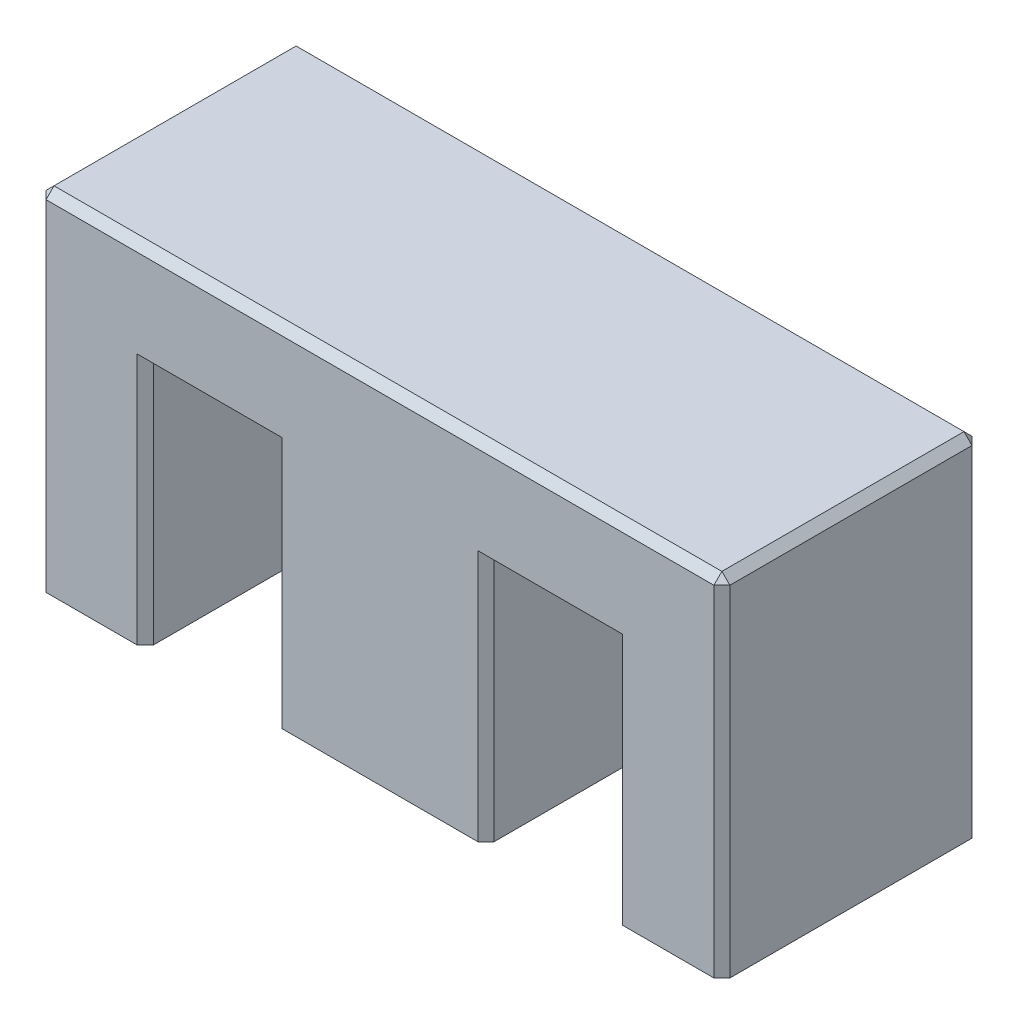
ISO-10303-21;
HEADER;
FILE_DESCRIPTION(('STEP AP214'),'2;1');
FILE_NAME('part.step','',(''),(''),'','','');
FILE_SCHEMA(('AUTOMOTIVE_DESIGN { 1 0 10303 214 1 1 1 1 }'));
ENDSEC;
DATA;
#1=APPLICATION_CONTEXT('core data for automotive mechanical design processes');
#2=APPLICATION_PROTOCOL_DEFINITION('international standard','automotive_design',2000,#1);
#3=PRODUCT_CONTEXT('',#1,'mechanical');
#4=PRODUCT('Part','Part','',(#3));
#5=PRODUCT_RELATED_PRODUCT_CATEGORY('part','',(#4));
#6=PRODUCT_DEFINITION_FORMATION('','',#4);
#7=PRODUCT_DEFINITION_CONTEXT('part definition',#1,'design');
#8=PRODUCT_DEFINITION('design','',#6,#7);
#9=PRODUCT_DEFINITION_SHAPE('','',#8);
#10=(LENGTH_UNIT() NAMED_UNIT(*) SI_UNIT(.MILLI.,.METRE.));
#11=(NAMED_UNIT(*) PLANE_ANGLE_UNIT() SI_UNIT($,.RADIAN.));
#12=(NAMED_UNIT(*) SI_UNIT($,.STERADIAN.) SOLID_ANGLE_UNIT());
#13=UNCERTAINTY_MEASURE_WITH_UNIT(LENGTH_MEASURE(1.E-05),#10,'distance_accuracy_value','');
#14=(GEOMETRIC_REPRESENTATION_CONTEXT(3) GLOBAL_UNCERTAINTY_ASSIGNED_CONTEXT((#13)) GLOBAL_UNIT_ASSIGNED_CONTEXT((#10,
#11,#12)) REPRESENTATION_CONTEXT('',''));
#15=CARTESIAN_POINT('',(0.,0.,0.));
#16=DIRECTION('',(0.,0.,1.));
#17=DIRECTION('',(1.,0.,0.));
#18=AXIS2_PLACEMENT_3D('',#15,#16,#17);
#19=CARTESIAN_POINT('',(13.25,8.75,16.125));
#20=DIRECTION('',(0.,1.,0.));
#21=DIRECTION('',(-1.,0.,0.));
#22=AXIS2_PLACEMENT_3D('',#19,#20,#21);
#23=PLANE('',#22);
#24=DIRECTION('',(0.,0.,-1.));
#25=VECTOR('',#24,1.);
#26=CARTESIAN_POINT('',(13.25,8.75,16.125));
#27=LINE('',#26,#25);
#28=CARTESIAN_POINT('',(13.25,8.75,15.125));
#29=VERTEX_POINT('',#28);
#30=CARTESIAN_POINT('',(13.25,8.75,-15.125));
#31=VERTEX_POINT('',#30);
#32=EDGE_CURVE('E414',#29,#31,#27,.T.);
#33=ORIENTED_EDGE('',*,*,#32,.T.);
#34=DIRECTION('',(1.,0.,0.));
#35=VECTOR('',#34,1.);
#36=CARTESIAN_POINT('',(29.325,8.75,-15.125));
#37=LINE('',#36,#35);
#38=CARTESIAN_POINT('',(29.325,8.75,-15.125));
#39=VERTEX_POINT('',#38);
#40=EDGE_CURVE('E348',#31,#39,#37,.T.);
#41=ORIENTED_EDGE('',*,*,#40,.T.);
#42=DIRECTION('',(0.,0.,-1.));
#43=VECTOR('',#42,1.);
#44=CARTESIAN_POINT('',(29.325,8.75,16.125));
#45=LINE('',#44,#43);
#46=CARTESIAN_POINT('',(29.325,8.75,15.125));
#47=VERTEX_POINT('',#46);
#48=EDGE_CURVE('E239',#47,#39,#45,.T.);
#49=ORIENTED_EDGE('',*,*,#48,.F.);
#50=DIRECTION('',(-1.,0.,0.));
#51=VECTOR('',#50,1.);
#52=CARTESIAN_POINT('',(13.25,8.75,15.125));
#53=LINE('',#52,#51);
#54=EDGE_CURVE('E350',#47,#29,#53,.T.);
#55=ORIENTED_EDGE('',*,*,#54,.T.);
#56=EDGE_LOOP('',(#33,#41,#49,#55));
#57=FACE_BOUND('',#56,.T.);
#58=ADVANCED_FACE('F35',(#57),#23,.F.);
#59=CARTESIAN_POINT('',(29.325,8.75,16.125));
#60=DIRECTION('',(1.,0.,0.));
#61=DIRECTION('',(0.,1.,0.));
#62=AXIS2_PLACEMENT_3D('',#59,#60,#61);
#63=PLANE('',#62);
#64=ORIENTED_EDGE('',*,*,#48,.T.);
#65=DIRECTION('',(0.,-1.,0.));
#66=VECTOR('',#65,1.);
#67=CARTESIAN_POINT('',(29.325,-21.75,-15.125));
#68=LINE('',#67,#66);
#69=CARTESIAN_POINT('',(29.325,-21.75,-15.125));
#70=VERTEX_POINT('',#69);
#71=EDGE_CURVE('E344',#39,#70,#68,.T.);
#72=ORIENTED_EDGE('',*,*,#71,.T.);
#73=DIRECTION('',(0.,0.,-1.));
#74=VECTOR('',#73,1.);
#75=CARTESIAN_POINT('',(29.325,-21.75,16.125));
#76=LINE('',#75,#74);
#77=CARTESIAN_POINT('',(29.325,-21.75,15.125));
#78=VERTEX_POINT('',#77);
#79=EDGE_CURVE('E397',#78,#70,#76,.T.);
#80=ORIENTED_EDGE('',*,*,#79,.F.);
#81=DIRECTION('',(0.,1.,0.));
#82=VECTOR('',#81,1.);
#83=CARTESIAN_POINT('',(29.325,8.75,15.125));
#84=LINE('',#83,#82);
#85=EDGE_CURVE('E346',#78,#47,#84,.T.);
#86=ORIENTED_EDGE('',*,*,#85,.T.);
#87=EDGE_LOOP('',(#64,#72,#80,#86));
#88=FACE_BOUND('',#87,.T.);
#89=ADVANCED_FACE('F516',(#88),#63,.F.);
#90=CARTESIAN_POINT('',(29.325,-21.75,16.125));
#91=DIRECTION('',(0.,1.,0.));
#92=DIRECTION('',(-1.,0.,0.));
#93=AXIS2_PLACEMENT_3D('',#90,#91,#92);
#94=PLANE('',#93);
#95=ORIENTED_EDGE('',*,*,#79,.T.);
#96=DIRECTION('',(0.707106781186548,0.,-0.707106781186547));
#97=VECTOR('',#96,1.);
#98=CARTESIAN_POINT('',(29.325,-21.75,-15.125));
#99=LINE('',#98,#97);
#100=CARTESIAN_POINT('',(30.325,-21.75,-16.125));
#101=VERTEX_POINT('',#100);
#102=EDGE_CURVE('E336',#70,#101,#99,.T.);
#103=ORIENTED_EDGE('',*,*,#102,.T.);
#104=DIRECTION('',(1.,0.,0.));
#105=VECTOR('',#104,1.);
#106=CARTESIAN_POINT('',(29.325,-21.75,-16.125));
#107=LINE('',#106,#105);
#108=CARTESIAN_POINT('',(41.725,-21.75,-16.125));
#109=VERTEX_POINT('',#108);
#110=EDGE_CURVE('E297',#101,#109,#107,.T.);
#111=ORIENTED_EDGE('',*,*,#110,.T.);
#112=DIRECTION('',(0.707106781186543,0.,0.707106781186552));
#113=VECTOR('',#112,1.);
#114=CARTESIAN_POINT('',(42.725,-21.75,-15.125));
#115=LINE('',#114,#113);
#116=CARTESIAN_POINT('',(42.725,-21.75,-15.125));
#117=VERTEX_POINT('',#116);
#118=EDGE_CURVE('E338',#109,#117,#115,.T.);
#119=ORIENTED_EDGE('',*,*,#118,.T.);
#120=DIRECTION('',(0.,0.,-1.));
#121=VECTOR('',#120,1.);
#122=CARTESIAN_POINT('',(42.725,-21.75,16.125));
#123=LINE('',#122,#121);
#124=CARTESIAN_POINT('',(42.725,-21.75,15.125));
#125=VERTEX_POINT('',#124);
#126=EDGE_CURVE('E400',#125,#117,#123,.T.);
#127=ORIENTED_EDGE('',*,*,#126,.F.);
#128=DIRECTION('',(0.707106781186543,0.,-0.707106781186552));
#129=VECTOR('',#128,1.);
#130=CARTESIAN_POINT('',(41.725,-21.75,16.125));
#131=LINE('',#130,#129);
#132=CARTESIAN_POINT('',(41.725,-21.75,16.125));
#133=VERTEX_POINT('',#132);
#134=EDGE_CURVE('E340',#125,#133,#131,.F.);
#135=ORIENTED_EDGE('',*,*,#134,.T.);
#136=DIRECTION('',(1.,0.,0.));
#137=VECTOR('',#136,1.);
#138=CARTESIAN_POINT('',(29.325,-21.75,16.125));
#139=LINE('',#138,#137);
#140=CARTESIAN_POINT('',(30.325,-21.75,16.125));
#141=VERTEX_POINT('',#140);
#142=EDGE_CURVE('E421',#141,#133,#139,.T.);
#143=ORIENTED_EDGE('',*,*,#142,.F.);
#144=DIRECTION('',(0.707106781186548,0.,0.707106781186547));
#145=VECTOR('',#144,1.);
#146=CARTESIAN_POINT('',(30.325,-21.75,16.125));
#147=LINE('',#146,#145);
#148=EDGE_CURVE('E342',#141,#78,#147,.F.);
#149=ORIENTED_EDGE('',*,*,#148,.T.);
#150=EDGE_LOOP('',(#95,#103,#111,#119,#127,#135,#143,#149));
#151=FACE_BOUND('',#150,.T.);
#152=ADVANCED_FACE('F513',(#151),#94,.F.);
#153=CARTESIAN_POINT('',(42.725,-21.75,16.125));
#154=DIRECTION('',(-1.,0.,0.));
#155=DIRECTION('',(0.,0.,1.));
#156=AXIS2_PLACEMENT_3D('',#153,#154,#155);
#157=PLANE('',#156);
#158=ORIENTED_EDGE('',*,*,#126,.T.);
#159=DIRECTION('',(0.,1.,0.));
#160=VECTOR('',#159,1.);
#161=CARTESIAN_POINT('',(42.725,21.75,-15.125));
#162=LINE('',#161,#160);
#163=CARTESIAN_POINT('',(42.725,20.75,-15.125));
#164=VERTEX_POINT('',#163);
#165=EDGE_CURVE('E320',#117,#164,#162,.T.);
#166=ORIENTED_EDGE('',*,*,#165,.T.);
#167=DIRECTION('',(0.,0.,1.));
#168=VECTOR('',#167,1.);
#169=CARTESIAN_POINT('',(42.725,20.75,16.125));
#170=LINE('',#169,#168);
#171=CARTESIAN_POINT('',(42.725,20.75,15.125));
#172=VERTEX_POINT('',#171);
#173=EDGE_CURVE('E322',#164,#172,#170,.T.);
#174=ORIENTED_EDGE('',*,*,#173,.T.);
#175=DIRECTION('',(0.,-1.,0.));
#176=VECTOR('',#175,1.);
#177=CARTESIAN_POINT('',(42.725,-21.75,15.125));
#178=LINE('',#177,#176);
#179=EDGE_CURVE('E325',#172,#125,#178,.T.);
#180=ORIENTED_EDGE('',*,*,#179,.T.);
#181=EDGE_LOOP('',(#158,#166,#174,#180));
#182=FACE_BOUND('',#181,.T.);
#183=ADVANCED_FACE('F540',(#182),#157,.F.);
#184=CARTESIAN_POINT('',(-42.725,21.75,16.125));
#185=DIRECTION('',(0.,-1.,0.));
#186=DIRECTION('',(1.,0.,0.));
#187=AXIS2_PLACEMENT_3D('',#184,#185,#186);
#188=PLANE('',#187);
#189=DIRECTION('',(1.,0.,0.));
#190=VECTOR('',#189,1.);
#191=CARTESIAN_POINT('',(-42.725,21.75,15.125));
#192=LINE('',#191,#190);
#193=CARTESIAN_POINT('',(-41.725,21.75,15.125));
#194=VERTEX_POINT('',#193);
#195=CARTESIAN_POINT('',(41.725,21.75,15.125));
#196=VERTEX_POINT('',#195);
#197=EDGE_CURVE('E334',#194,#196,#192,.T.);
#198=ORIENTED_EDGE('',*,*,#197,.T.);
#199=DIRECTION('',(0.,0.,-1.));
#200=VECTOR('',#199,1.);
#201=CARTESIAN_POINT('',(41.725,21.75,16.125));
#202=LINE('',#201,#200);
#203=CARTESIAN_POINT('',(41.725,21.75,-15.125));
#204=VERTEX_POINT('',#203);
#205=EDGE_CURVE('E327',#196,#204,#202,.T.);
#206=ORIENTED_EDGE('',*,*,#205,.T.);
#207=DIRECTION('',(-1.,0.,0.));
#208=VECTOR('',#207,1.);
#209=CARTESIAN_POINT('',(-42.725,21.75,-15.125));
#210=LINE('',#209,#208);
#211=CARTESIAN_POINT('',(-41.725,21.75,-15.125));
#212=VERTEX_POINT('',#211);
#213=EDGE_CURVE('E330',#204,#212,#210,.T.);
#214=ORIENTED_EDGE('',*,*,#213,.T.);
#215=DIRECTION('',(0.,0.,1.));
#216=VECTOR('',#215,1.);
#217=CARTESIAN_POINT('',(-41.725,21.75,16.125));
#218=LINE('',#217,#216);
#219=EDGE_CURVE('E332',#212,#194,#218,.T.);
#220=ORIENTED_EDGE('',*,*,#219,.T.);
#221=EDGE_LOOP('',(#198,#206,#214,#220));
#222=FACE_BOUND('',#221,.T.);
#223=ADVANCED_FACE('F543',(#222),#188,.F.);
#224=CARTESIAN_POINT('',(-42.725,-21.75,16.125));
#225=DIRECTION('',(1.,0.,0.));
#226=DIRECTION('',(0.,0.,-1.));
#227=AXIS2_PLACEMENT_3D('',#224,#225,#226);
#228=PLANE('',#227);
#229=DIRECTION('',(0.,0.,-1.));
#230=VECTOR('',#229,1.);
#231=CARTESIAN_POINT('',(-42.725,20.75,16.125));
#232=LINE('',#231,#230);
#233=CARTESIAN_POINT('',(-42.725,20.75,15.125));
#234=VERTEX_POINT('',#233);
#235=CARTESIAN_POINT('',(-42.725,20.75,-15.125));
#236=VERTEX_POINT('',#235);
#237=EDGE_CURVE('E316',#234,#236,#232,.T.);
#238=ORIENTED_EDGE('',*,*,#237,.T.);
#239=DIRECTION('',(0.,-1.,0.));
#240=VECTOR('',#239,1.);
#241=CARTESIAN_POINT('',(-42.725,-21.75,-15.125));
#242=LINE('',#241,#240);
#243=CARTESIAN_POINT('',(-42.725,-21.75,-15.125));
#244=VERTEX_POINT('',#243);
#245=EDGE_CURVE('E314',#236,#244,#242,.T.);
#246=ORIENTED_EDGE('',*,*,#245,.T.);
#247=DIRECTION('',(0.,0.,-1.));
#248=VECTOR('',#247,1.);
#249=CARTESIAN_POINT('',(-42.725,-21.75,16.125));
#250=LINE('',#249,#248);
#251=CARTESIAN_POINT('',(-42.725,-21.75,15.125));
#252=VERTEX_POINT('',#251);
#253=EDGE_CURVE('E403',#252,#244,#250,.T.);
#254=ORIENTED_EDGE('',*,*,#253,.F.);
#255=DIRECTION('',(0.,1.,0.));
#256=VECTOR('',#255,1.);
#257=CARTESIAN_POINT('',(-42.725,-21.75,15.125));
#258=LINE('',#257,#256);
#259=EDGE_CURVE('E318',#252,#234,#258,.T.);
#260=ORIENTED_EDGE('',*,*,#259,.T.);
#261=EDGE_LOOP('',(#238,#246,#254,#260));
#262=FACE_BOUND('',#261,.T.);
#263=ADVANCED_FACE('F549',(#262),#228,.F.);
#264=CARTESIAN_POINT('',(-29.325,-21.75,16.125));
#265=DIRECTION('',(0.,1.,0.));
#266=DIRECTION('',(0.,0.,1.));
#267=AXIS2_PLACEMENT_3D('',#264,#265,#266);
#268=PLANE('',#267);
#269=DIRECTION('',(1.,0.,0.));
#270=VECTOR('',#269,1.);
#271=CARTESIAN_POINT('',(-29.325,-21.75,-16.125));
#272=LINE('',#271,#270);
#273=CARTESIAN_POINT('',(-41.725,-21.75,-16.125));
#274=VERTEX_POINT('',#273);
#275=CARTESIAN_POINT('',(-30.325,-21.75,-16.125));
#276=VERTEX_POINT('',#275);
#277=EDGE_CURVE('E422',#274,#276,#272,.T.);
#278=ORIENTED_EDGE('',*,*,#277,.T.);
#279=DIRECTION('',(0.707106781186548,0.,0.707106781186548));
#280=VECTOR('',#279,1.);
#281=CARTESIAN_POINT('',(-29.325,-21.75,-15.125));
#282=LINE('',#281,#280);
#283=CARTESIAN_POINT('',(-29.325,-21.75,-15.125));
#284=VERTEX_POINT('',#283);
#285=EDGE_CURVE('E220',#276,#284,#282,.T.);
#286=ORIENTED_EDGE('',*,*,#285,.T.);
#287=DIRECTION('',(0.,0.,-1.));
#288=VECTOR('',#287,1.);
#289=CARTESIAN_POINT('',(-29.325,-21.75,16.125));
#290=LINE('',#289,#288);
#291=CARTESIAN_POINT('',(-29.325,-21.75,15.125));
#292=VERTEX_POINT('',#291);
#293=EDGE_CURVE('E231',#292,#284,#290,.T.);
#294=ORIENTED_EDGE('',*,*,#293,.F.);
#295=DIRECTION('',(0.707106781186548,0.,-0.707106781186548));
#296=VECTOR('',#295,1.);
#297=CARTESIAN_POINT('',(-30.325,-21.75,16.125));
#298=LINE('',#297,#296);
#299=CARTESIAN_POINT('',(-30.325,-21.75,16.125));
#300=VERTEX_POINT('',#299);
#301=EDGE_CURVE('E238',#292,#300,#298,.F.);
#302=ORIENTED_EDGE('',*,*,#301,.T.);
#303=DIRECTION('',(1.,0.,0.));
#304=VECTOR('',#303,1.);
#305=CARTESIAN_POINT('',(-29.325,-21.75,16.125));
#306=LINE('',#305,#304);
#307=CARTESIAN_POINT('',(-41.725,-21.75,16.125));
#308=VERTEX_POINT('',#307);
#309=EDGE_CURVE('E429',#308,#300,#306,.T.);
#310=ORIENTED_EDGE('',*,*,#309,.F.);
#311=DIRECTION('',(0.707106781186543,0.,0.707106781186552));
#312=VECTOR('',#311,1.);
#313=CARTESIAN_POINT('',(-41.725,-21.75,16.125));
#314=LINE('',#313,#312);
#315=EDGE_CURVE('E373',#308,#252,#314,.F.);
#316=ORIENTED_EDGE('',*,*,#315,.T.);
#317=ORIENTED_EDGE('',*,*,#253,.T.);
#318=DIRECTION('',(0.707106781186552,0.,-0.707106781186543));
#319=VECTOR('',#318,1.);
#320=CARTESIAN_POINT('',(-42.725,-21.75,-15.125));
#321=LINE('',#320,#319);
#322=EDGE_CURVE('E371',#244,#274,#321,.T.);
#323=ORIENTED_EDGE('',*,*,#322,.T.);
#324=EDGE_LOOP('',(#278,#286,#294,#302,#310,#316,#317,#323));
#325=FACE_BOUND('',#324,.T.);
#326=ADVANCED_FACE('F460',(#325),#268,.F.);
#327=CARTESIAN_POINT('',(-29.325,8.74999999999999,16.125));
#328=DIRECTION('',(-1.,0.,0.));
#329=DIRECTION('',(0.,0.,1.));
#330=AXIS2_PLACEMENT_3D('',#327,#328,#329);
#331=PLANE('',#330);
#332=ORIENTED_EDGE('',*,*,#293,.T.);
#333=DIRECTION('',(0.,1.,0.));
#334=VECTOR('',#333,1.);
#335=CARTESIAN_POINT('',(-29.325,8.74999999999999,-15.125));
#336=LINE('',#335,#334);
#337=CARTESIAN_POINT('',(-29.325,8.74999999999999,-15.125));
#338=VERTEX_POINT('',#337);
#339=EDGE_CURVE('E230',#284,#338,#336,.T.);
#340=ORIENTED_EDGE('',*,*,#339,.T.);
#341=DIRECTION('',(0.,0.,-1.));
#342=VECTOR('',#341,1.);
#343=CARTESIAN_POINT('',(-29.325,8.74999999999999,16.125));
#344=LINE('',#343,#342);
#345=CARTESIAN_POINT('',(-29.325,8.74999999999999,15.125));
#346=VERTEX_POINT('',#345);
#347=EDGE_CURVE('E212',#346,#338,#344,.T.);
#348=ORIENTED_EDGE('',*,*,#347,.F.);
#349=DIRECTION('',(0.,-1.,0.));
#350=VECTOR('',#349,1.);
#351=CARTESIAN_POINT('',(-29.325,8.74999999999999,15.125));
#352=LINE('',#351,#350);
#353=EDGE_CURVE('E227',#346,#292,#352,.T.);
#354=ORIENTED_EDGE('',*,*,#353,.T.);
#355=EDGE_LOOP('',(#332,#340,#348,#354));
#356=FACE_BOUND('',#355,.T.);
#357=ADVANCED_FACE('F226',(#356),#331,.F.);
#358=CARTESIAN_POINT('',(-13.25,8.74999999999999,16.125));
#359=DIRECTION('',(0.,1.,0.));
#360=DIRECTION('',(-1.,0.,0.));
#361=AXIS2_PLACEMENT_3D('',#358,#359,#360);
#362=PLANE('',#361);
#363=ORIENTED_EDGE('',*,*,#347,.T.);
#364=DIRECTION('',(1.,0.,0.));
#365=VECTOR('',#364,1.);
#366=CARTESIAN_POINT('',(-13.25,8.74999999999999,-15.125));
#367=LINE('',#366,#365);
#368=CARTESIAN_POINT('',(-13.25,8.74999999999999,-15.125));
#369=VERTEX_POINT('',#368);
#370=EDGE_CURVE('E219',#338,#369,#367,.T.);
#371=ORIENTED_EDGE('',*,*,#370,.T.);
#372=DIRECTION('',(0.,0.,-1.));
#373=VECTOR('',#372,1.);
#374=CARTESIAN_POINT('',(-13.25,8.74999999999999,16.125));
#375=LINE('',#374,#373);
#376=CARTESIAN_POINT('',(-13.25,8.74999999999999,15.125));
#377=VERTEX_POINT('',#376);
#378=EDGE_CURVE('E214',#377,#369,#375,.T.);
#379=ORIENTED_EDGE('',*,*,#378,.F.);
#380=DIRECTION('',(-1.,0.,0.));
#381=VECTOR('',#380,1.);
#382=CARTESIAN_POINT('',(-13.25,8.74999999999999,15.125));
#383=LINE('',#382,#381);
#384=EDGE_CURVE('E209',#377,#346,#383,.T.);
#385=ORIENTED_EDGE('',*,*,#384,.T.);
#386=EDGE_LOOP('',(#363,#371,#379,#385));
#387=FACE_BOUND('',#386,.T.);
#388=ADVANCED_FACE('F211',(#387),#362,.F.);
#389=CARTESIAN_POINT('',(-13.25,-21.75,16.125));
#390=DIRECTION('',(1.,0.,0.));
#391=DIRECTION('',(0.,0.,-1.));
#392=AXIS2_PLACEMENT_3D('',#389,#390,#391);
#393=PLANE('',#392);
#394=ORIENTED_EDGE('',*,*,#378,.T.);
#395=DIRECTION('',(0.,-1.,0.));
#396=VECTOR('',#395,1.);
#397=CARTESIAN_POINT('',(-13.25,-21.75,-15.125));
#398=LINE('',#397,#396);
#399=CARTESIAN_POINT('',(-13.25,-21.75,-15.125));
#400=VERTEX_POINT('',#399);
#401=EDGE_CURVE('E365',#369,#400,#398,.T.);
#402=ORIENTED_EDGE('',*,*,#401,.T.);
#403=DIRECTION('',(0.,0.,-1.));
#404=VECTOR('',#403,1.);
#405=CARTESIAN_POINT('',(-13.25,-21.75,16.125));
#406=LINE('',#405,#404);
#407=CARTESIAN_POINT('',(-13.25,-21.75,15.125));
#408=VERTEX_POINT('',#407);
#409=EDGE_CURVE('E408',#408,#400,#406,.T.);
#410=ORIENTED_EDGE('',*,*,#409,.F.);
#411=DIRECTION('',(0.,1.,0.));
#412=VECTOR('',#411,1.);
#413=CARTESIAN_POINT('',(-13.25,-21.75,15.125));
#414=LINE('',#413,#412);
#415=EDGE_CURVE('E367',#408,#377,#414,.T.);
#416=ORIENTED_EDGE('',*,*,#415,.T.);
#417=EDGE_LOOP('',(#394,#402,#410,#416));
#418=FACE_BOUND('',#417,.T.);
#419=ADVANCED_FACE('F474',(#418),#393,.F.);
#420=CARTESIAN_POINT('',(13.25,-21.75,16.125));
#421=DIRECTION('',(0.,1.,0.));
#422=DIRECTION('',(-1.,0.,0.));
#423=AXIS2_PLACEMENT_3D('',#420,#421,#422);
#424=PLANE('',#423);
#425=ORIENTED_EDGE('',*,*,#409,.T.);
#426=DIRECTION('',(0.707106781186548,0.,-0.707106781186548));
#427=VECTOR('',#426,1.);
#428=CARTESIAN_POINT('',(-13.25,-21.75,-15.125));
#429=LINE('',#428,#427);
#430=CARTESIAN_POINT('',(-12.25,-21.75,-16.125));
#431=VERTEX_POINT('',#430);
#432=EDGE_CURVE('E357',#400,#431,#429,.T.);
#433=ORIENTED_EDGE('',*,*,#432,.T.);
#434=DIRECTION('',(1.,0.,0.));
#435=VECTOR('',#434,1.);
#436=CARTESIAN_POINT('',(13.25,-21.75,-16.125));
#437=LINE('',#436,#435);
#438=CARTESIAN_POINT('',(12.25,-21.75,-16.125));
#439=VERTEX_POINT('',#438);
#440=EDGE_CURVE('E418',#431,#439,#437,.T.);
#441=ORIENTED_EDGE('',*,*,#440,.T.);
#442=DIRECTION('',(0.707106781186548,0.,0.707106781186547));
#443=VECTOR('',#442,1.);
#444=CARTESIAN_POINT('',(13.25,-21.75,-15.125));
#445=LINE('',#444,#443);
#446=CARTESIAN_POINT('',(13.25,-21.75,-15.125));
#447=VERTEX_POINT('',#446);
#448=EDGE_CURVE('E359',#439,#447,#445,.T.);
#449=ORIENTED_EDGE('',*,*,#448,.T.);
#450=DIRECTION('',(0.,0.,-1.));
#451=VECTOR('',#450,1.);
#452=CARTESIAN_POINT('',(13.25,-21.75,16.125));
#453=LINE('',#452,#451);
#454=CARTESIAN_POINT('',(13.25,-21.75,15.125));
#455=VERTEX_POINT('',#454);
#456=EDGE_CURVE('E411',#455,#447,#453,.T.);
#457=ORIENTED_EDGE('',*,*,#456,.F.);
#458=DIRECTION('',(0.707106781186548,0.,-0.707106781186547));
#459=VECTOR('',#458,1.);
#460=CARTESIAN_POINT('',(12.25,-21.75,16.125));
#461=LINE('',#460,#459);
#462=CARTESIAN_POINT('',(12.25,-21.75,16.125));
#463=VERTEX_POINT('',#462);
#464=EDGE_CURVE('E361',#455,#463,#461,.F.);
#465=ORIENTED_EDGE('',*,*,#464,.T.);
#466=DIRECTION('',(1.,0.,0.));
#467=VECTOR('',#466,1.);
#468=CARTESIAN_POINT('',(13.25,-21.75,16.125));
#469=LINE('',#468,#467);
#470=CARTESIAN_POINT('',(-12.25,-21.75,16.125));
#471=VERTEX_POINT('',#470);
#472=EDGE_CURVE('E417',#471,#463,#469,.T.);
#473=ORIENTED_EDGE('',*,*,#472,.F.);
#474=DIRECTION('',(0.707106781186548,0.,0.707106781186548));
#475=VECTOR('',#474,1.);
#476=CARTESIAN_POINT('',(-12.25,-21.75,16.125));
#477=LINE('',#476,#475);
#478=EDGE_CURVE('E363',#471,#408,#477,.F.);
#479=ORIENTED_EDGE('',*,*,#478,.T.);
#480=EDGE_LOOP('',(#425,#433,#441,#449,#457,#465,#473,#479));
#481=FACE_BOUND('',#480,.T.);
#482=ADVANCED_FACE('F482',(#481),#424,.F.);
#483=CARTESIAN_POINT('',(13.25,-21.75,16.125));
#484=DIRECTION('',(-1.,0.,0.));
#485=DIRECTION('',(0.,-1.,0.));
#486=AXIS2_PLACEMENT_3D('',#483,#484,#485);
#487=PLANE('',#486);
#488=ORIENTED_EDGE('',*,*,#456,.T.);
#489=DIRECTION('',(0.,1.,0.));
#490=VECTOR('',#489,1.);
#491=CARTESIAN_POINT('',(13.25,8.75,-15.125));
#492=LINE('',#491,#490);
#493=EDGE_CURVE('E352',#447,#31,#492,.T.);
#494=ORIENTED_EDGE('',*,*,#493,.T.);
#495=ORIENTED_EDGE('',*,*,#32,.F.);
#496=DIRECTION('',(0.,-1.,0.));
#497=VECTOR('',#496,1.);
#498=CARTESIAN_POINT('',(13.25,-21.75,15.125));
#499=LINE('',#498,#497);
#500=EDGE_CURVE('E355',#29,#455,#499,.T.);
#501=ORIENTED_EDGE('',*,*,#500,.T.);
#502=EDGE_LOOP('',(#488,#494,#495,#501));
#503=FACE_BOUND('',#502,.T.);
#504=ADVANCED_FACE('F500',(#503),#487,.F.);
#505=CARTESIAN_POINT('',(0.,0.,16.125));
#506=DIRECTION('',(0.,0.,-1.));
#507=DIRECTION('',(-1.,0.,0.));
#508=AXIS2_PLACEMENT_3D('',#505,#506,#507);
#509=PLANE('',#508);
#510=DIRECTION('',(-1.,0.,0.));
#511=VECTOR('',#510,1.);
#512=CARTESIAN_POINT('',(0.,20.75,16.125));
#513=LINE('',#512,#511);
#514=CARTESIAN_POINT('',(41.725,20.75,16.125));
#515=VERTEX_POINT('',#514);
#516=CARTESIAN_POINT('',(-41.725,20.75,16.125));
#517=VERTEX_POINT('',#516);
#518=EDGE_CURVE('E45',#515,#517,#513,.T.);
#519=ORIENTED_EDGE('',*,*,#518,.T.);
#520=DIRECTION('',(0.,-1.,0.));
#521=VECTOR('',#520,1.);
#522=CARTESIAN_POINT('',(-41.725,0.,16.125));
#523=LINE('',#522,#521);
#524=EDGE_CURVE('E11',#517,#308,#523,.T.);
#525=ORIENTED_EDGE('',*,*,#524,.T.);
#526=ORIENTED_EDGE('',*,*,#309,.T.);
#527=DIRECTION('',(0.,1.,0.));
#528=VECTOR('',#527,1.);
#529=CARTESIAN_POINT('',(-30.325,0.,16.125));
#530=LINE('',#529,#528);
#531=CARTESIAN_POINT('',(-30.325,9.74999999999999,16.125));
#532=VERTEX_POINT('',#531);
#533=EDGE_CURVE('E312',#300,#532,#530,.T.);
#534=ORIENTED_EDGE('',*,*,#533,.T.);
#535=DIRECTION('',(1.,0.,0.));
#536=VECTOR('',#535,1.);
#537=CARTESIAN_POINT('',(0.,9.75,16.125));
#538=LINE('',#537,#536);
#539=CARTESIAN_POINT('',(-12.25,9.74999999999999,16.125));
#540=VERTEX_POINT('',#539);
#541=EDGE_CURVE('E242',#532,#540,#538,.T.);
#542=ORIENTED_EDGE('',*,*,#541,.T.);
#543=DIRECTION('',(0.,-1.,0.));
#544=VECTOR('',#543,1.);
#545=CARTESIAN_POINT('',(-12.25,0.,16.125));
#546=LINE('',#545,#544);
#547=EDGE_CURVE('E308',#540,#471,#546,.T.);
#548=ORIENTED_EDGE('',*,*,#547,.T.);
#549=ORIENTED_EDGE('',*,*,#472,.T.);
#550=DIRECTION('',(0.,1.,0.));
#551=VECTOR('',#550,1.);
#552=CARTESIAN_POINT('',(12.25,0.,16.125));
#553=LINE('',#552,#551);
#554=CARTESIAN_POINT('',(12.25,9.75000000000001,16.125));
#555=VERTEX_POINT('',#554);
#556=EDGE_CURVE('E306',#463,#555,#553,.T.);
#557=ORIENTED_EDGE('',*,*,#556,.T.);
#558=DIRECTION('',(1.,0.,0.));
#559=VECTOR('',#558,1.);
#560=CARTESIAN_POINT('',(0.,9.75000000000001,16.125));
#561=LINE('',#560,#559);
#562=CARTESIAN_POINT('',(30.325,9.75000000000001,16.125));
#563=VERTEX_POINT('',#562);
#564=EDGE_CURVE('E304',#555,#563,#561,.T.);
#565=ORIENTED_EDGE('',*,*,#564,.T.);
#566=DIRECTION('',(0.,-1.,0.));
#567=VECTOR('',#566,1.);
#568=CARTESIAN_POINT('',(30.325,0.,16.125));
#569=LINE('',#568,#567);
#570=EDGE_CURVE('E301',#563,#141,#569,.T.);
#571=ORIENTED_EDGE('',*,*,#570,.T.);
#572=ORIENTED_EDGE('',*,*,#142,.T.);
#573=DIRECTION('',(0.,1.,0.));
#574=VECTOR('',#573,1.);
#575=CARTESIAN_POINT('',(41.725,0.,16.125));
#576=LINE('',#575,#574);
#577=EDGE_CURVE('E56',#133,#515,#576,.T.);
#578=ORIENTED_EDGE('',*,*,#577,.T.);
#579=EDGE_LOOP('',(#519,#525,#526,#534,#542,#548,#549,#557,#565,#571,#572,#578));
#580=FACE_BOUND('',#579,.T.);
#581=ADVANCED_FACE('F433',(#580),#509,.F.);
#582=CARTESIAN_POINT('',(0.,0.,-16.125));
#583=DIRECTION('',(0.,0.,-1.));
#584=DIRECTION('',(-1.,0.,0.));
#585=AXIS2_PLACEMENT_3D('',#582,#583,#584);
#586=PLANE('',#585);
#587=DIRECTION('',(-1.,0.,0.));
#588=VECTOR('',#587,1.);
#589=CARTESIAN_POINT('',(-29.325,9.74999999999999,-16.125));
#590=LINE('',#589,#588);
#591=CARTESIAN_POINT('',(-12.25,9.74999999999999,-16.125));
#592=VERTEX_POINT('',#591);
#593=CARTESIAN_POINT('',(-30.325,9.74999999999999,-16.125));
#594=VERTEX_POINT('',#593);
#595=EDGE_CURVE('E378',#592,#594,#590,.T.);
#596=ORIENTED_EDGE('',*,*,#595,.T.);
#597=DIRECTION('',(0.,-1.,0.));
#598=VECTOR('',#597,1.);
#599=CARTESIAN_POINT('',(-30.325,-21.75,-16.125));
#600=LINE('',#599,#598);
#601=EDGE_CURVE('E376',#594,#276,#600,.T.);
#602=ORIENTED_EDGE('',*,*,#601,.T.);
#603=ORIENTED_EDGE('',*,*,#277,.F.);
#604=DIRECTION('',(0.,1.,0.));
#605=VECTOR('',#604,1.);
#606=CARTESIAN_POINT('',(-41.725,21.75,-16.125));
#607=LINE('',#606,#605);
#608=CARTESIAN_POINT('',(-41.725,20.75,-16.125));
#609=VERTEX_POINT('',#608);
#610=EDGE_CURVE('E392',#274,#609,#607,.T.);
#611=ORIENTED_EDGE('',*,*,#610,.T.);
#612=DIRECTION('',(1.,0.,0.));
#613=VECTOR('',#612,1.);
#614=CARTESIAN_POINT('',(42.725,20.75,-16.125));
#615=LINE('',#614,#613);
#616=CARTESIAN_POINT('',(41.725,20.75,-16.125));
#617=VERTEX_POINT('',#616);
#618=EDGE_CURVE('E390',#609,#617,#615,.T.);
#619=ORIENTED_EDGE('',*,*,#618,.T.);
#620=DIRECTION('',(0.,-1.,0.));
#621=VECTOR('',#620,1.);
#622=CARTESIAN_POINT('',(41.725,-21.75,-16.125));
#623=LINE('',#622,#621);
#624=EDGE_CURVE('E388',#617,#109,#623,.T.);
#625=ORIENTED_EDGE('',*,*,#624,.T.);
#626=ORIENTED_EDGE('',*,*,#110,.F.);
#627=DIRECTION('',(0.,1.,0.));
#628=VECTOR('',#627,1.);
#629=CARTESIAN_POINT('',(30.325,8.75,-16.125));
#630=LINE('',#629,#628);
#631=CARTESIAN_POINT('',(30.325,9.75,-16.125));
#632=VERTEX_POINT('',#631);
#633=EDGE_CURVE('E386',#101,#632,#630,.T.);
#634=ORIENTED_EDGE('',*,*,#633,.T.);
#635=DIRECTION('',(-1.,0.,0.));
#636=VECTOR('',#635,1.);
#637=CARTESIAN_POINT('',(13.25,9.75,-16.125));
#638=LINE('',#637,#636);
#639=CARTESIAN_POINT('',(12.25,9.75,-16.125));
#640=VERTEX_POINT('',#639);
#641=EDGE_CURVE('E384',#632,#640,#638,.T.);
#642=ORIENTED_EDGE('',*,*,#641,.T.);
#643=DIRECTION('',(0.,-1.,0.));
#644=VECTOR('',#643,1.);
#645=CARTESIAN_POINT('',(12.25,-21.75,-16.125));
#646=LINE('',#645,#644);
#647=EDGE_CURVE('E382',#640,#439,#646,.T.);
#648=ORIENTED_EDGE('',*,*,#647,.T.);
#649=ORIENTED_EDGE('',*,*,#440,.F.);
#650=DIRECTION('',(0.,1.,0.));
#651=VECTOR('',#650,1.);
#652=CARTESIAN_POINT('',(-12.25,8.74999999999999,-16.125));
#653=LINE('',#652,#651);
#654=EDGE_CURVE('E380',#431,#592,#653,.T.);
#655=ORIENTED_EDGE('',*,*,#654,.T.);
#656=EDGE_LOOP('',(#596,#602,#603,#611,#619,#625,#626,#634,#642,#648,#649,#655));
#657=FACE_BOUND('',#656,.T.);
#658=ADVANCED_FACE('F485',(#657),#586,.T.);
#659=CARTESIAN_POINT('',(-13.25,-21.75,-15.125));
#660=DIRECTION('',(-0.707106781186547,0.,-0.707106781186547));
#661=DIRECTION('',(0.,1.,0.));
#662=AXIS2_PLACEMENT_3D('',#659,#660,#661);
#663=PLANE('',#662);
#664=ORIENTED_EDGE('',*,*,#432,.F.);
#665=ORIENTED_EDGE('',*,*,#401,.F.);
#666=DIRECTION('',(0.577350269189626,0.577350269189626,-0.577350269189626));
#667=VECTOR('',#666,1.);
#668=CARTESIAN_POINT('',(-13.25,8.74999999999999,-15.125));
#669=LINE('',#668,#667);
#670=EDGE_CURVE('E294',#592,#369,#669,.F.);
#671=ORIENTED_EDGE('',*,*,#670,.F.);
#672=ORIENTED_EDGE('',*,*,#654,.F.);
#673=EDGE_LOOP('',(#664,#665,#671,#672));
#674=FACE_BOUND('',#673,.T.);
#675=ADVANCED_FACE('F478',(#674),#663,.T.);
#676=CARTESIAN_POINT('',(-13.25,8.74999999999999,-15.125));
#677=DIRECTION('',(0.,-0.707106781186547,-0.707106781186548));
#678=DIRECTION('',(-1.,0.,0.));
#679=AXIS2_PLACEMENT_3D('',#676,#677,#678);
#680=PLANE('',#679);
#681=ORIENTED_EDGE('',*,*,#670,.T.);
#682=ORIENTED_EDGE('',*,*,#370,.F.);
#683=DIRECTION('',(-0.577350269189626,0.577350269189626,-0.577350269189626));
#684=VECTOR('',#683,1.);
#685=CARTESIAN_POINT('',(-29.325,8.74999999999999,-15.125));
#686=LINE('',#685,#684);
#687=EDGE_CURVE('E292',#594,#338,#686,.F.);
#688=ORIENTED_EDGE('',*,*,#687,.F.);
#689=ORIENTED_EDGE('',*,*,#595,.F.);
#690=EDGE_LOOP('',(#681,#682,#688,#689));
#691=FACE_BOUND('',#690,.T.);
#692=ADVANCED_FACE('F470',(#691),#680,.T.);
#693=CARTESIAN_POINT('',(-29.325,8.74999999999999,-15.125));
#694=DIRECTION('',(0.707106781186547,0.,-0.707106781186547));
#695=DIRECTION('',(0.,-1.,0.));
#696=AXIS2_PLACEMENT_3D('',#693,#694,#695);
#697=PLANE('',#696);
#698=ORIENTED_EDGE('',*,*,#285,.F.);
#699=ORIENTED_EDGE('',*,*,#601,.F.);
#700=ORIENTED_EDGE('',*,*,#687,.T.);
#701=ORIENTED_EDGE('',*,*,#339,.F.);
#702=EDGE_LOOP('',(#698,#699,#700,#701));
#703=FACE_BOUND('',#702,.T.);
#704=ADVANCED_FACE('F464',(#703),#697,.T.);
#705=CARTESIAN_POINT('',(29.325,8.75,-15.125));
#706=DIRECTION('',(-0.707106781186547,0.,-0.707106781186548));
#707=DIRECTION('',(0.,1.,0.));
#708=AXIS2_PLACEMENT_3D('',#705,#706,#707);
#709=PLANE('',#708);
#710=ORIENTED_EDGE('',*,*,#102,.F.);
#711=ORIENTED_EDGE('',*,*,#71,.F.);
#712=DIRECTION('',(0.577350269189626,0.577350269189626,-0.577350269189626));
#713=VECTOR('',#712,1.);
#714=CARTESIAN_POINT('',(23.9666666666667,3.39166666666666,-9.76666666666666));
#715=LINE('',#714,#713);
#716=EDGE_CURVE('E289',#632,#39,#715,.F.);
#717=ORIENTED_EDGE('',*,*,#716,.F.);
#718=ORIENTED_EDGE('',*,*,#633,.F.);
#719=EDGE_LOOP('',(#710,#711,#717,#718));
#720=FACE_BOUND('',#719,.T.);
#721=ADVANCED_FACE('F519',(#720),#709,.T.);
#722=CARTESIAN_POINT('',(13.25,8.75,-15.125));
#723=DIRECTION('',(0.,-0.707106781186548,-0.707106781186547));
#724=DIRECTION('',(-1.,0.,0.));
#725=AXIS2_PLACEMENT_3D('',#722,#723,#724);
#726=PLANE('',#725);
#727=ORIENTED_EDGE('',*,*,#716,.T.);
#728=ORIENTED_EDGE('',*,*,#40,.F.);
#729=DIRECTION('',(-0.577350269189626,0.577350269189626,-0.577350269189626));
#730=VECTOR('',#729,1.);
#731=CARTESIAN_POINT('',(23.4166666666667,-1.41666666666666,-4.95833333333334));
#732=LINE('',#731,#730);
#733=EDGE_CURVE('E258',#640,#31,#732,.F.);
#734=ORIENTED_EDGE('',*,*,#733,.F.);
#735=ORIENTED_EDGE('',*,*,#641,.F.);
#736=EDGE_LOOP('',(#727,#728,#734,#735));
#737=FACE_BOUND('',#736,.T.);
#738=ADVANCED_FACE('F494',(#737),#726,.T.);
#739=CARTESIAN_POINT('',(13.25,-21.75,-15.125));
#740=DIRECTION('',(0.707106781186547,0.,-0.707106781186548));
#741=DIRECTION('',(0.,-1.,0.));
#742=AXIS2_PLACEMENT_3D('',#739,#740,#741);
#743=PLANE('',#742);
#744=ORIENTED_EDGE('',*,*,#448,.F.);
#745=ORIENTED_EDGE('',*,*,#647,.F.);
#746=ORIENTED_EDGE('',*,*,#733,.T.);
#747=ORIENTED_EDGE('',*,*,#493,.F.);
#748=EDGE_LOOP('',(#744,#745,#746,#747));
#749=FACE_BOUND('',#748,.T.);
#750=ADVANCED_FACE('F490',(#749),#743,.T.);
#751=CARTESIAN_POINT('',(-41.725,0.,16.125));
#752=DIRECTION('',(0.707106781186552,0.,-0.707106781186543));
#753=DIRECTION('',(0.,-1.,0.));
#754=AXIS2_PLACEMENT_3D('',#751,#752,#753);
#755=PLANE('',#754);
#756=ORIENTED_EDGE('',*,*,#315,.F.);
#757=ORIENTED_EDGE('',*,*,#524,.F.);
#758=DIRECTION('',(-0.707106781186543,0.,-0.707106781186552));
#759=VECTOR('',#758,1.);
#760=CARTESIAN_POINT('',(-42.225,20.75,15.625));
#761=LINE('',#760,#759);
#762=EDGE_CURVE('E255',#234,#517,#761,.F.);
#763=ORIENTED_EDGE('',*,*,#762,.F.);
#764=ORIENTED_EDGE('',*,*,#259,.F.);
#765=EDGE_LOOP('',(#756,#757,#763,#764));
#766=FACE_BOUND('',#765,.T.);
#767=ADVANCED_FACE('F457',(#766),#755,.F.);
#768=CARTESIAN_POINT('',(-42.725,20.75,16.125));
#769=DIRECTION('',(0.707106781186543,-0.707106781186552,0.));
#770=DIRECTION('',(0.,0.,-1.));
#771=AXIS2_PLACEMENT_3D('',#768,#769,#770);
#772=PLANE('',#771);
#773=DIRECTION('',(-0.707106781186552,-0.707106781186543,0.));
#774=VECTOR('',#773,1.);
#775=CARTESIAN_POINT('',(-41.725,21.75,-15.125));
#776=LINE('',#775,#774);
#777=EDGE_CURVE('E262',#236,#212,#776,.F.);
#778=ORIENTED_EDGE('',*,*,#777,.F.);
#779=ORIENTED_EDGE('',*,*,#237,.F.);
#780=DIRECTION('',(0.707106781186552,0.707106781186543,0.));
#781=VECTOR('',#780,1.);
#782=CARTESIAN_POINT('',(-41.725,21.75,15.125));
#783=LINE('',#782,#781);
#784=EDGE_CURVE('E259',#194,#234,#783,.F.);
#785=ORIENTED_EDGE('',*,*,#784,.F.);
#786=ORIENTED_EDGE('',*,*,#219,.F.);
#787=EDGE_LOOP('',(#778,#779,#785,#786));
#788=FACE_BOUND('',#787,.T.);
#789=ADVANCED_FACE('F647',(#788),#772,.F.);
#790=CARTESIAN_POINT('',(-42.725,-21.75,-15.125));
#791=DIRECTION('',(-0.707106781186543,0.,-0.707106781186552));
#792=DIRECTION('',(0.,1.,0.));
#793=AXIS2_PLACEMENT_3D('',#790,#791,#792);
#794=PLANE('',#793);
#795=ORIENTED_EDGE('',*,*,#322,.F.);
#796=ORIENTED_EDGE('',*,*,#245,.F.);
#797=DIRECTION('',(-0.707106781186552,0.,0.707106781186543));
#798=VECTOR('',#797,1.);
#799=CARTESIAN_POINT('',(-42.225,20.75,-15.625));
#800=LINE('',#799,#798);
#801=EDGE_CURVE('E265',#609,#236,#800,.T.);
#802=ORIENTED_EDGE('',*,*,#801,.F.);
#803=ORIENTED_EDGE('',*,*,#610,.F.);
#804=EDGE_LOOP('',(#795,#796,#802,#803));
#805=FACE_BOUND('',#804,.T.);
#806=ADVANCED_FACE('F641',(#805),#794,.T.);
#807=CARTESIAN_POINT('',(-41.725,21.75,15.125));
#808=DIRECTION('',(-0.577350269189626,0.577350269189634,0.577350269189618));
#809=DIRECTION('',(-0.707106781186552,-0.707106781186543,0.));
#810=AXIS2_PLACEMENT_3D('',#807,#808,#809);
#811=PLANE('',#810);
#812=ORIENTED_EDGE('',*,*,#784,.T.);
#813=ORIENTED_EDGE('',*,*,#762,.T.);
#814=DIRECTION('',(0.,-0.707106781186542,0.707106781186553));
#815=VECTOR('',#814,1.);
#816=CARTESIAN_POINT('',(-41.725,21.75,15.125));
#817=LINE('',#816,#815);
#818=EDGE_CURVE('E268',#194,#517,#817,.T.);
#819=ORIENTED_EDGE('',*,*,#818,.F.);
#820=EDGE_LOOP('',(#812,#813,#819));
#821=FACE_BOUND('',#820,.T.);
#822=ADVANCED_FACE('F451',(#821),#811,.T.);
#823=CARTESIAN_POINT('',(-41.725,21.75,-15.125));
#824=DIRECTION('',(-0.577350269189619,0.577350269189626,-0.577350269189632));
#825=DIRECTION('',(0.,0.707106781186551,0.707106781186544));
#826=AXIS2_PLACEMENT_3D('',#823,#824,#825);
#827=PLANE('',#826);
#828=ORIENTED_EDGE('',*,*,#801,.T.);
#829=ORIENTED_EDGE('',*,*,#777,.T.);
#830=DIRECTION('',(0.,-0.707106781186552,-0.707106781186543));
#831=VECTOR('',#830,1.);
#832=CARTESIAN_POINT('',(-41.725,21.75,-15.125));
#833=LINE('',#832,#831);
#834=EDGE_CURVE('E271',#609,#212,#833,.F.);
#835=ORIENTED_EDGE('',*,*,#834,.F.);
#836=EDGE_LOOP('',(#828,#829,#835));
#837=FACE_BOUND('',#836,.T.);
#838=ADVANCED_FACE('F629',(#837),#827,.T.);
#839=CARTESIAN_POINT('',(41.725,0.,16.125));
#840=DIRECTION('',(-0.707106781186552,0.,-0.707106781186543));
#841=DIRECTION('',(0.,1.,0.));
#842=AXIS2_PLACEMENT_3D('',#839,#840,#841);
#843=PLANE('',#842);
#844=ORIENTED_EDGE('',*,*,#134,.F.);
#845=ORIENTED_EDGE('',*,*,#179,.F.);
#846=DIRECTION('',(-0.707106781186543,0.,0.707106781186552));
#847=VECTOR('',#846,1.);
#848=CARTESIAN_POINT('',(42.725,20.75,15.125));
#849=LINE('',#848,#847);
#850=EDGE_CURVE('E274',#515,#172,#849,.F.);
#851=ORIENTED_EDGE('',*,*,#850,.F.);
#852=ORIENTED_EDGE('',*,*,#577,.F.);
#853=EDGE_LOOP('',(#844,#845,#851,#852));
#854=FACE_BOUND('',#853,.T.);
#855=ADVANCED_FACE('F439',(#854),#843,.F.);
#856=CARTESIAN_POINT('',(0.,20.75,16.125));
#857=DIRECTION('',(0.,-0.707106781186553,-0.707106781186542));
#858=DIRECTION('',(-1.,0.,0.));
#859=AXIS2_PLACEMENT_3D('',#856,#857,#858);
#860=PLANE('',#859);
#861=ORIENTED_EDGE('',*,*,#818,.T.);
#862=ORIENTED_EDGE('',*,*,#518,.F.);
#863=DIRECTION('',(0.,0.707106781186542,-0.707106781186553));
#864=VECTOR('',#863,1.);
#865=CARTESIAN_POINT('',(41.725,21.25,15.625));
#866=LINE('',#865,#864);
#867=EDGE_CURVE('E277',#196,#515,#866,.F.);
#868=ORIENTED_EDGE('',*,*,#867,.F.);
#869=ORIENTED_EDGE('',*,*,#197,.F.);
#870=EDGE_LOOP('',(#861,#862,#868,#869));
#871=FACE_BOUND('',#870,.T.);
#872=ADVANCED_FACE('F448',(#871),#860,.F.);
#873=CARTESIAN_POINT('',(-42.725,21.75,-15.125));
#874=DIRECTION('',(0.,0.707106781186543,-0.707106781186552));
#875=DIRECTION('',(1.,0.,0.));
#876=AXIS2_PLACEMENT_3D('',#873,#874,#875);
#877=PLANE('',#876);
#878=ORIENTED_EDGE('',*,*,#834,.T.);
#879=ORIENTED_EDGE('',*,*,#213,.F.);
#880=DIRECTION('',(0.,0.707106781186552,0.707106781186543));
#881=VECTOR('',#880,1.);
#882=CARTESIAN_POINT('',(41.725,21.75,-15.125));
#883=LINE('',#882,#881);
#884=EDGE_CURVE('E280',#617,#204,#883,.T.);
#885=ORIENTED_EDGE('',*,*,#884,.F.);
#886=ORIENTED_EDGE('',*,*,#618,.F.);
#887=EDGE_LOOP('',(#878,#879,#885,#886));
#888=FACE_BOUND('',#887,.T.);
#889=ADVANCED_FACE('F533',(#888),#877,.T.);
#890=CARTESIAN_POINT('',(42.725,-21.75,-15.125));
#891=DIRECTION('',(0.707106781186552,0.,-0.707106781186543));
#892=DIRECTION('',(0.,-1.,0.));
#893=AXIS2_PLACEMENT_3D('',#890,#891,#892);
#894=PLANE('',#893);
#895=ORIENTED_EDGE('',*,*,#118,.F.);
#896=ORIENTED_EDGE('',*,*,#624,.F.);
#897=DIRECTION('',(-0.707106781186543,0.,-0.707106781186552));
#898=VECTOR('',#897,1.);
#899=CARTESIAN_POINT('',(42.225,20.75,-15.625));
#900=LINE('',#899,#898);
#901=EDGE_CURVE('E283',#164,#617,#900,.T.);
#902=ORIENTED_EDGE('',*,*,#901,.F.);
#903=ORIENTED_EDGE('',*,*,#165,.F.);
#904=EDGE_LOOP('',(#895,#896,#902,#903));
#905=FACE_BOUND('',#904,.T.);
#906=ADVANCED_FACE('F528',(#905),#894,.T.);
#907=CARTESIAN_POINT('',(42.725,20.75,15.125));
#908=DIRECTION('',(0.577350269189636,0.577350269189624,0.577350269189616));
#909=DIRECTION('',(-0.70710678118654,0.707106781186555,0.));
#910=AXIS2_PLACEMENT_3D('',#907,#908,#909);
#911=PLANE('',#910);
#912=ORIENTED_EDGE('',*,*,#867,.T.);
#913=ORIENTED_EDGE('',*,*,#850,.T.);
#914=DIRECTION('',(0.70710678118654,-0.707106781186555,0.));
#915=VECTOR('',#914,1.);
#916=CARTESIAN_POINT('',(42.725,20.75,15.125));
#917=LINE('',#916,#915);
#918=EDGE_CURVE('E286',#196,#172,#917,.T.);
#919=ORIENTED_EDGE('',*,*,#918,.F.);
#920=EDGE_LOOP('',(#912,#913,#919));
#921=FACE_BOUND('',#920,.T.);
#922=ADVANCED_FACE('F444',(#921),#911,.T.);
#923=CARTESIAN_POINT('',(41.725,21.75,-15.125));
#924=DIRECTION('',(0.577350269189637,0.577350269189617,-0.577350269189623));
#925=DIRECTION('',(-0.707106781186539,0.,-0.707106781186556));
#926=AXIS2_PLACEMENT_3D('',#923,#924,#925);
#927=PLANE('',#926);
#928=ORIENTED_EDGE('',*,*,#901,.T.);
#929=ORIENTED_EDGE('',*,*,#884,.T.);
#930=DIRECTION('',(-0.70710678118654,0.707106781186555,0.));
#931=VECTOR('',#930,1.);
#932=CARTESIAN_POINT('',(41.725,21.75,-15.125));
#933=LINE('',#932,#931);
#934=EDGE_CURVE('E253',#164,#204,#933,.T.);
#935=ORIENTED_EDGE('',*,*,#934,.F.);
#936=EDGE_LOOP('',(#928,#929,#935));
#937=FACE_BOUND('',#936,.T.);
#938=ADVANCED_FACE('F536',(#937),#927,.T.);
#939=CARTESIAN_POINT('',(41.725,21.75,16.125));
#940=DIRECTION('',(-0.707106781186555,-0.70710678118654,0.));
#941=DIRECTION('',(0.,0.,-1.));
#942=AXIS2_PLACEMENT_3D('',#939,#940,#941);
#943=PLANE('',#942);
#944=ORIENTED_EDGE('',*,*,#918,.T.);
#945=ORIENTED_EDGE('',*,*,#173,.F.);
#946=ORIENTED_EDGE('',*,*,#934,.T.);
#947=ORIENTED_EDGE('',*,*,#205,.F.);
#948=EDGE_LOOP('',(#944,#945,#946,#947));
#949=FACE_BOUND('',#948,.T.);
#950=ADVANCED_FACE('F538',(#949),#943,.F.);
#951=CARTESIAN_POINT('',(12.25,0.,16.125));
#952=DIRECTION('',(-0.707106781186547,0.,-0.707106781186548));
#953=DIRECTION('',(0.,1.,0.));
#954=AXIS2_PLACEMENT_3D('',#951,#952,#953);
#955=PLANE('',#954);
#956=ORIENTED_EDGE('',*,*,#464,.F.);
#957=ORIENTED_EDGE('',*,*,#500,.F.);
#958=DIRECTION('',(-0.577350269189626,0.577350269189626,0.577350269189626));
#959=VECTOR('',#958,1.);
#960=CARTESIAN_POINT('',(8.16666666666665,13.8333333333333,20.2083333333333));
#961=LINE('',#960,#959);
#962=EDGE_CURVE('E246',#555,#29,#961,.F.);
#963=ORIENTED_EDGE('',*,*,#962,.F.);
#964=ORIENTED_EDGE('',*,*,#556,.F.);
#965=EDGE_LOOP('',(#956,#957,#963,#964));
#966=FACE_BOUND('',#965,.T.);
#967=ADVANCED_FACE('F598',(#966),#955,.F.);
#968=CARTESIAN_POINT('',(0.,9.75000000000001,16.125));
#969=DIRECTION('',(0.,0.707106781186548,-0.707106781186547));
#970=DIRECTION('',(1.,0.,0.));
#971=AXIS2_PLACEMENT_3D('',#968,#969,#970);
#972=PLANE('',#971);
#973=ORIENTED_EDGE('',*,*,#962,.T.);
#974=ORIENTED_EDGE('',*,*,#54,.F.);
#975=DIRECTION('',(0.577350269189626,0.577350269189625,0.577350269189626));
#976=VECTOR('',#975,1.);
#977=CARTESIAN_POINT('',(27.075,6.50000000000002,12.875));
#978=LINE('',#977,#976);
#979=EDGE_CURVE('E243',#563,#47,#978,.F.);
#980=ORIENTED_EDGE('',*,*,#979,.F.);
#981=ORIENTED_EDGE('',*,*,#564,.F.);
#982=EDGE_LOOP('',(#973,#974,#980,#981));
#983=FACE_BOUND('',#982,.T.);
#984=ADVANCED_FACE('F506',(#983),#972,.F.);
#985=CARTESIAN_POINT('',(30.325,0.,16.125));
#986=DIRECTION('',(0.707106781186547,0.,-0.707106781186548));
#987=DIRECTION('',(0.,-1.,0.));
#988=AXIS2_PLACEMENT_3D('',#985,#986,#987);
#989=PLANE('',#988);
#990=ORIENTED_EDGE('',*,*,#979,.T.);
#991=ORIENTED_EDGE('',*,*,#85,.F.);
#992=ORIENTED_EDGE('',*,*,#148,.F.);
#993=ORIENTED_EDGE('',*,*,#570,.F.);
#994=EDGE_LOOP('',(#990,#991,#992,#993));
#995=FACE_BOUND('',#994,.T.);
#996=ADVANCED_FACE('F511',(#995),#989,.F.);
#997=CARTESIAN_POINT('',(-30.325,0.,16.125));
#998=DIRECTION('',(-0.707106781186547,0.,-0.707106781186547));
#999=DIRECTION('',(0.,1.,0.));
#1000=AXIS2_PLACEMENT_3D('',#997,#998,#999);
#1001=PLANE('',#1000);
#1002=ORIENTED_EDGE('',*,*,#301,.F.);
#1003=ORIENTED_EDGE('',*,*,#353,.F.);
#1004=DIRECTION('',(-0.577350269189626,0.577350269189626,0.577350269189626));
#1005=VECTOR('',#1004,1.);
#1006=CARTESIAN_POINT('',(-20.2166666666667,-0.358333333333339,6.01666666666667));
#1007=LINE('',#1006,#1005);
#1008=EDGE_CURVE('E40',#532,#346,#1007,.F.);
#1009=ORIENTED_EDGE('',*,*,#1008,.F.);
#1010=ORIENTED_EDGE('',*,*,#533,.F.);
#1011=EDGE_LOOP('',(#1002,#1003,#1009,#1010));
#1012=FACE_BOUND('',#1011,.T.);
#1013=ADVANCED_FACE('F38',(#1012),#1001,.F.);
#1014=CARTESIAN_POINT('',(0.,9.75,16.125));
#1015=DIRECTION('',(0.,0.707106781186547,-0.707106781186548));
#1016=DIRECTION('',(1.,0.,0.));
#1017=AXIS2_PLACEMENT_3D('',#1014,#1015,#1016);
#1018=PLANE('',#1017);
#1019=ORIENTED_EDGE('',*,*,#1008,.T.);
#1020=ORIENTED_EDGE('',*,*,#384,.F.);
#1021=DIRECTION('',(0.577350269189626,0.577350269189626,0.577350269189626));
#1022=VECTOR('',#1021,1.);
#1023=CARTESIAN_POINT('',(-15.5,6.5,12.875));
#1024=LINE('',#1023,#1022);
#1025=EDGE_CURVE('E244',#540,#377,#1024,.F.);
#1026=ORIENTED_EDGE('',*,*,#1025,.F.);
#1027=ORIENTED_EDGE('',*,*,#541,.F.);
#1028=EDGE_LOOP('',(#1019,#1020,#1026,#1027));
#1029=FACE_BOUND('',#1028,.T.);
#1030=ADVANCED_FACE('F241',(#1029),#1018,.F.);
#1031=CARTESIAN_POINT('',(-12.25,0.,16.125));
#1032=DIRECTION('',(0.707106781186547,0.,-0.707106781186547));
#1033=DIRECTION('',(0.,-1.,0.));
#1034=AXIS2_PLACEMENT_3D('',#1031,#1032,#1033);
#1035=PLANE('',#1034);
#1036=ORIENTED_EDGE('',*,*,#1025,.T.);
#1037=ORIENTED_EDGE('',*,*,#415,.F.);
#1038=ORIENTED_EDGE('',*,*,#478,.F.);
#1039=ORIENTED_EDGE('',*,*,#547,.F.);
#1040=EDGE_LOOP('',(#1036,#1037,#1038,#1039));
#1041=FACE_BOUND('',#1040,.T.);
#1042=ADVANCED_FACE('F674',(#1041),#1035,.F.);
#1043=CLOSED_SHELL('',(#58,#89,#152,#183,#223,#263,#326,#357,#388,#419,#482,#504,#581,#658,#675,
#692,#704,#721,#738,#750,#767,#789,#806,#822,#838,#855,#872,#889,#906,#922,#938,#950,#967,#984,
#996,#1013,#1030,#1042));
#1044=MANIFOLD_SOLID_BREP('B2',#1043);
#1045=ADVANCED_BREP_SHAPE_REPRESENTATION('',(#18,#1044),#14);
#1046=SHAPE_DEFINITION_REPRESENTATION(#9,#1045);
ENDSEC;
END-ISO-10303-21;
